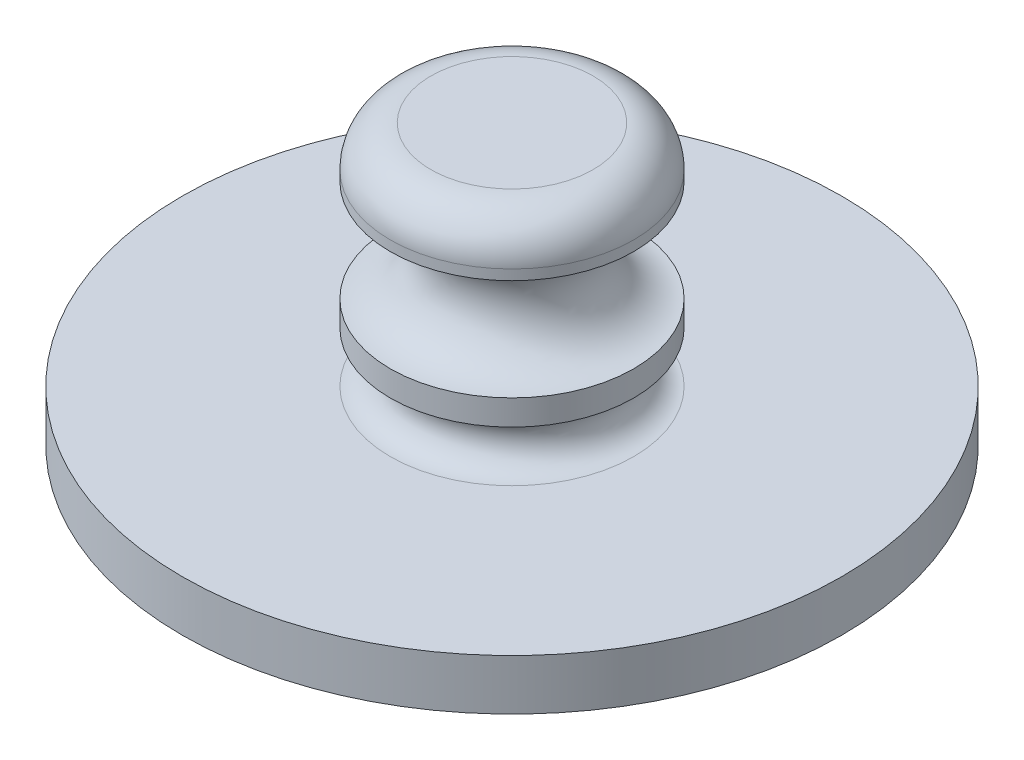
ISO-10303-21;
HEADER;
FILE_DESCRIPTION(('STEP AP214'),'2;1');
FILE_NAME('part.step','',(''),(''),'','','');
FILE_SCHEMA(('AUTOMOTIVE_DESIGN { 1 0 10303 214 1 1 1 1 }'));
ENDSEC;
DATA;
#1=APPLICATION_CONTEXT('core data for automotive mechanical design processes');
#2=APPLICATION_PROTOCOL_DEFINITION('international standard','automotive_design',2000,#1);
#3=PRODUCT_CONTEXT('',#1,'mechanical');
#4=PRODUCT('Part','Part','',(#3));
#5=PRODUCT_RELATED_PRODUCT_CATEGORY('part','',(#4));
#6=PRODUCT_DEFINITION_FORMATION('','',#4);
#7=PRODUCT_DEFINITION_CONTEXT('part definition',#1,'design');
#8=PRODUCT_DEFINITION('design','',#6,#7);
#9=PRODUCT_DEFINITION_SHAPE('','',#8);
#10=(LENGTH_UNIT() NAMED_UNIT(*) SI_UNIT(.MILLI.,.METRE.));
#11=(NAMED_UNIT(*) PLANE_ANGLE_UNIT() SI_UNIT($,.RADIAN.));
#12=(NAMED_UNIT(*) SI_UNIT($,.STERADIAN.) SOLID_ANGLE_UNIT());
#13=UNCERTAINTY_MEASURE_WITH_UNIT(LENGTH_MEASURE(1.E-05),#10,'distance_accuracy_value','');
#14=(GEOMETRIC_REPRESENTATION_CONTEXT(3) GLOBAL_UNCERTAINTY_ASSIGNED_CONTEXT((#13)) GLOBAL_UNIT_ASSIGNED_CONTEXT((#10,
#11,#12)) REPRESENTATION_CONTEXT('',''));
#15=CARTESIAN_POINT('',(0.,0.,0.));
#16=DIRECTION('',(0.,0.,1.));
#17=DIRECTION('',(1.,0.,0.));
#18=AXIS2_PLACEMENT_3D('',#15,#16,#17);
#19=CARTESIAN_POINT('',(0.,4.7,0.));
#20=DIRECTION('',(0.,-1.,0.));
#21=DIRECTION('',(0.,0.,-1.));
#22=AXIS2_PLACEMENT_3D('',#19,#20,#21);
#23=TOROIDAL_SURFACE('',#22,1.6,0.8);
#24=CARTESIAN_POINT('',(0.,4.7,0.));
#25=DIRECTION('',(0.,-1.,0.));
#26=DIRECTION('',(0.,0.,-1.));
#27=AXIS2_PLACEMENT_3D('',#24,#25,#26);
#28=CIRCLE('',#27,2.4);
#29=CARTESIAN_POINT('',(0.,4.7,-2.4));
#30=VERTEX_POINT('',#29);
#31=EDGE_CURVE('E71',#30,#30,#28,.T.);
#32=ORIENTED_EDGE('',*,*,#31,.F.);
#33=EDGE_LOOP('',(#32));
#34=FACE_BOUND('',#33,.T.);
#35=CARTESIAN_POINT('',(0.,5.5,0.));
#36=DIRECTION('',(0.,-1.,0.));
#37=DIRECTION('',(0.,0.,-1.));
#38=AXIS2_PLACEMENT_3D('',#35,#36,#37);
#39=CIRCLE('',#38,1.6);
#40=CARTESIAN_POINT('',(0.,5.5,-1.6));
#41=VERTEX_POINT('',#40);
#42=EDGE_CURVE('E10',#41,#41,#39,.T.);
#43=ORIENTED_EDGE('',*,*,#42,.T.);
#44=EDGE_LOOP('',(#43));
#45=FACE_BOUND('',#44,.T.);
#46=ADVANCED_FACE('F43',(#34,#45),#23,.T.);
#47=CARTESIAN_POINT('',(0.,5.5,0.));
#48=DIRECTION('',(0.,-1.,0.));
#49=DIRECTION('',(0.,0.,-1.));
#50=AXIS2_PLACEMENT_3D('',#47,#48,#49);
#51=PLANE('',#50);
#52=ORIENTED_EDGE('',*,*,#42,.F.);
#53=EDGE_LOOP('',(#52));
#54=FACE_BOUND('',#53,.T.);
#55=ADVANCED_FACE('F79',(#54),#51,.F.);
#56=CARTESIAN_POINT('',(0.,0.,0.));
#57=DIRECTION('',(0.,-1.,0.));
#58=DIRECTION('',(0.,0.,-1.));
#59=AXIS2_PLACEMENT_3D('',#56,#57,#58);
#60=PLANE('',#59);
#61=CARTESIAN_POINT('',(0.,0.,0.));
#62=DIRECTION('',(0.,-1.,0.));
#63=DIRECTION('',(0.,0.,-1.));
#64=AXIS2_PLACEMENT_3D('',#61,#62,#63);
#65=CIRCLE('',#64,6.5);
#66=CARTESIAN_POINT('',(0.,0.,-6.5));
#67=VERTEX_POINT('',#66);
#68=EDGE_CURVE('E49',#67,#67,#65,.T.);
#69=ORIENTED_EDGE('',*,*,#68,.T.);
#70=EDGE_LOOP('',(#69));
#71=FACE_BOUND('',#70,.T.);
#72=ADVANCED_FACE('F83',(#71),#60,.T.);
#73=CARTESIAN_POINT('',(0.,0.,0.));
#74=DIRECTION('',(0.,-1.,0.));
#75=DIRECTION('',(0.,0.,-1.));
#76=AXIS2_PLACEMENT_3D('',#73,#74,#75);
#77=CYLINDRICAL_SURFACE('',#76,6.5);
#78=CARTESIAN_POINT('',(0.,1.,0.));
#79=DIRECTION('',(0.,-1.,0.));
#80=DIRECTION('',(0.,0.,-1.));
#81=AXIS2_PLACEMENT_3D('',#78,#79,#80);
#82=CIRCLE('',#81,6.5);
#83=CARTESIAN_POINT('',(0.,1.,-6.5));
#84=VERTEX_POINT('',#83);
#85=EDGE_CURVE('E53',#84,#84,#82,.T.);
#86=ORIENTED_EDGE('',*,*,#85,.T.);
#87=EDGE_LOOP('',(#86));
#88=FACE_BOUND('',#87,.T.);
#89=ORIENTED_EDGE('',*,*,#68,.F.);
#90=EDGE_LOOP('',(#89));
#91=FACE_BOUND('',#90,.T.);
#92=ADVANCED_FACE('F88',(#88,#91),#77,.T.);
#93=CARTESIAN_POINT('',(0.,1.,0.));
#94=DIRECTION('',(0.,-1.,0.));
#95=DIRECTION('',(0.,0.,-1.));
#96=AXIS2_PLACEMENT_3D('',#93,#94,#95);
#97=PLANE('',#96);
#98=ORIENTED_EDGE('',*,*,#85,.F.);
#99=EDGE_LOOP('',(#98));
#100=FACE_BOUND('',#99,.T.);
#101=CARTESIAN_POINT('',(0.,1.,0.));
#102=DIRECTION('',(0.,-1.,0.));
#103=DIRECTION('',(0.,0.,-1.));
#104=AXIS2_PLACEMENT_3D('',#101,#102,#103);
#105=CIRCLE('',#104,2.4);
#106=CARTESIAN_POINT('',(0.,1.,-2.4));
#107=VERTEX_POINT('',#106);
#108=EDGE_CURVE('E57',#107,#107,#105,.T.);
#109=ORIENTED_EDGE('',*,*,#108,.T.);
#110=EDGE_LOOP('',(#109));
#111=FACE_BOUND('',#110,.T.);
#112=ADVANCED_FACE('F93',(#100,#111),#97,.F.);
#113=CARTESIAN_POINT('',(0.,1.5,0.));
#114=DIRECTION('',(0.,-1.,0.));
#115=DIRECTION('',(0.,0.,-1.));
#116=AXIS2_PLACEMENT_3D('',#113,#114,#115);
#117=TOROIDAL_SURFACE('',#116,2.4,0.5);
#118=CARTESIAN_POINT('',(0.,2.,0.));
#119=DIRECTION('',(0.,-1.,0.));
#120=DIRECTION('',(0.,0.,-1.));
#121=AXIS2_PLACEMENT_3D('',#118,#119,#120);
#122=CIRCLE('',#121,2.4);
#123=CARTESIAN_POINT('',(0.,2.,-2.4));
#124=VERTEX_POINT('',#123);
#125=EDGE_CURVE('E62',#124,#124,#122,.T.);
#126=ORIENTED_EDGE('',*,*,#125,.T.);
#127=EDGE_LOOP('',(#126));
#128=FACE_BOUND('',#127,.T.);
#129=ORIENTED_EDGE('',*,*,#108,.F.);
#130=EDGE_LOOP('',(#129));
#131=FACE_BOUND('',#130,.T.);
#132=ADVANCED_FACE('F97',(#128,#131),#117,.F.);
#133=CARTESIAN_POINT('',(0.,0.,0.));
#134=DIRECTION('',(0.,-1.,0.));
#135=DIRECTION('',(0.,0.,-1.));
#136=AXIS2_PLACEMENT_3D('',#133,#134,#135);
#137=CYLINDRICAL_SURFACE('',#136,2.4);
#138=CARTESIAN_POINT('',(0.,2.5,0.));
#139=DIRECTION('',(0.,-1.,0.));
#140=DIRECTION('',(0.,0.,-1.));
#141=AXIS2_PLACEMENT_3D('',#138,#139,#140);
#142=CIRCLE('',#141,2.4);
#143=CARTESIAN_POINT('',(0.,2.5,-2.4));
#144=VERTEX_POINT('',#143);
#145=EDGE_CURVE('E65',#144,#144,#142,.T.);
#146=ORIENTED_EDGE('',*,*,#145,.T.);
#147=EDGE_LOOP('',(#146));
#148=FACE_BOUND('',#147,.T.);
#149=ORIENTED_EDGE('',*,*,#125,.F.);
#150=EDGE_LOOP('',(#149));
#151=FACE_BOUND('',#150,.T.);
#152=ADVANCED_FACE('F101',(#148,#151),#137,.T.);
#153=CARTESIAN_POINT('',(0.,3.5,0.));
#154=DIRECTION('',(0.,-1.,0.));
#155=DIRECTION('',(0.,0.,-1.));
#156=AXIS2_PLACEMENT_3D('',#153,#154,#155);
#157=TOROIDAL_SURFACE('',#156,2.4,1.);
#158=CARTESIAN_POINT('',(0.,4.5,0.));
#159=DIRECTION('',(0.,-1.,0.));
#160=DIRECTION('',(0.,0.,-1.));
#161=AXIS2_PLACEMENT_3D('',#158,#159,#160);
#162=CIRCLE('',#161,2.4);
#163=CARTESIAN_POINT('',(0.,4.5,-2.4));
#164=VERTEX_POINT('',#163);
#165=EDGE_CURVE('E68',#164,#164,#162,.T.);
#166=ORIENTED_EDGE('',*,*,#165,.T.);
#167=EDGE_LOOP('',(#166));
#168=FACE_BOUND('',#167,.T.);
#169=ORIENTED_EDGE('',*,*,#145,.F.);
#170=EDGE_LOOP('',(#169));
#171=FACE_BOUND('',#170,.T.);
#172=ADVANCED_FACE('F105',(#168,#171),#157,.F.);
#173=CARTESIAN_POINT('',(0.,0.,0.));
#174=DIRECTION('',(0.,-1.,0.));
#175=DIRECTION('',(0.,0.,-1.));
#176=AXIS2_PLACEMENT_3D('',#173,#174,#175);
#177=CYLINDRICAL_SURFACE('',#176,2.4);
#178=ORIENTED_EDGE('',*,*,#31,.T.);
#179=EDGE_LOOP('',(#178));
#180=FACE_BOUND('',#179,.T.);
#181=ORIENTED_EDGE('',*,*,#165,.F.);
#182=EDGE_LOOP('',(#181));
#183=FACE_BOUND('',#182,.T.);
#184=ADVANCED_FACE('F75',(#180,#183),#177,.T.);
#185=CLOSED_SHELL('',(#46,#55,#72,#92,#112,#132,#152,#172,#184));
#186=MANIFOLD_SOLID_BREP('B2',#185);
#187=ADVANCED_BREP_SHAPE_REPRESENTATION('',(#18,#186),#14);
#188=SHAPE_DEFINITION_REPRESENTATION(#9,#187);
ENDSEC;
END-ISO-10303-21;
